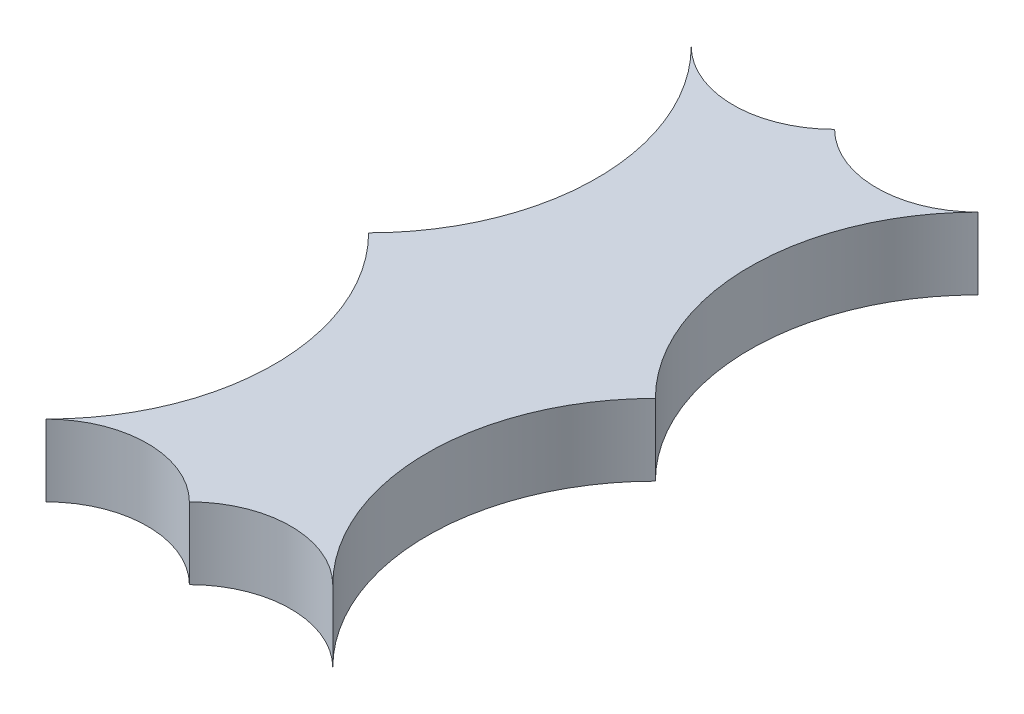
ISO-10303-21;
HEADER;
FILE_DESCRIPTION(('STEP AP214'),'2;1');
FILE_NAME('part.step','',(''),(''),'','','');
FILE_SCHEMA(('AUTOMOTIVE_DESIGN { 1 0 10303 214 1 1 1 1 }'));
ENDSEC;
DATA;
#1=APPLICATION_CONTEXT('core data for automotive mechanical design processes');
#2=APPLICATION_PROTOCOL_DEFINITION('international standard','automotive_design',2000,#1);
#3=PRODUCT_CONTEXT('',#1,'mechanical');
#4=PRODUCT('Part','Part','',(#3));
#5=PRODUCT_RELATED_PRODUCT_CATEGORY('part','',(#4));
#6=PRODUCT_DEFINITION_FORMATION('','',#4);
#7=PRODUCT_DEFINITION_CONTEXT('part definition',#1,'design');
#8=PRODUCT_DEFINITION('design','',#6,#7);
#9=PRODUCT_DEFINITION_SHAPE('','',#8);
#10=(LENGTH_UNIT() NAMED_UNIT(*) SI_UNIT(.MILLI.,.METRE.));
#11=(NAMED_UNIT(*) PLANE_ANGLE_UNIT() SI_UNIT($,.RADIAN.));
#12=(NAMED_UNIT(*) SI_UNIT($,.STERADIAN.) SOLID_ANGLE_UNIT());
#13=UNCERTAINTY_MEASURE_WITH_UNIT(LENGTH_MEASURE(1.E-05),#10,'distance_accuracy_value','');
#14=(GEOMETRIC_REPRESENTATION_CONTEXT(3) GLOBAL_UNCERTAINTY_ASSIGNED_CONTEXT((#13)) GLOBAL_UNIT_ASSIGNED_CONTEXT((#10,
#11,#12)) REPRESENTATION_CONTEXT('',''));
#15=CARTESIAN_POINT('',(0.,0.,0.));
#16=DIRECTION('',(0.,0.,1.));
#17=DIRECTION('',(1.,0.,0.));
#18=AXIS2_PLACEMENT_3D('',#15,#16,#17);
#19=CARTESIAN_POINT('',(33.9500661578985,4.,-49.2380522932094));
#20=DIRECTION('',(0.,-1.,0.));
#21=DIRECTION('',(0.,0.,-1.));
#22=AXIS2_PLACEMENT_3D('',#19,#20,#21);
#23=CYLINDRICAL_SURFACE('',#22,5.65685424949223);
#24=CARTESIAN_POINT('',(33.9500661578985,0.,-49.2380522932094));
#25=DIRECTION('',(0.,-1.,0.));
#26=DIRECTION('',(0.,0.,-1.));
#27=AXIS2_PLACEMENT_3D('',#24,#25,#26);
#28=CIRCLE('',#27,5.65685424949223);
#29=CARTESIAN_POINT('',(37.9500661578985,0.,-45.2380522932096));
#30=VERTEX_POINT('',#29);
#31=CARTESIAN_POINT('',(29.9500661578985,0.,-45.2380522932096));
#32=VERTEX_POINT('',#31);
#33=EDGE_CURVE('E147',#30,#32,#28,.T.);
#34=ORIENTED_EDGE('',*,*,#33,.T.);
#35=DIRECTION('',(0.,-1.,0.));
#36=VECTOR('',#35,1.);
#37=CARTESIAN_POINT('',(29.9500661578985,4.,-45.2380522932096));
#38=LINE('',#37,#36);
#39=CARTESIAN_POINT('',(29.9500661578985,4.,-45.2380522932096));
#40=VERTEX_POINT('',#39);
#41=EDGE_CURVE('E11',#40,#32,#38,.T.);
#42=ORIENTED_EDGE('',*,*,#41,.F.);
#43=CARTESIAN_POINT('',(33.9500661578985,4.,-49.2380522932094));
#44=DIRECTION('',(0.,-1.,0.));
#45=DIRECTION('',(0.,0.,-1.));
#46=AXIS2_PLACEMENT_3D('',#43,#44,#45);
#47=CIRCLE('',#46,5.65685424949223);
#48=CARTESIAN_POINT('',(37.9500661578985,4.,-45.2380522932096));
#49=VERTEX_POINT('',#48);
#50=EDGE_CURVE('E166',#49,#40,#47,.T.);
#51=ORIENTED_EDGE('',*,*,#50,.F.);
#52=DIRECTION('',(0.,-1.,0.));
#53=VECTOR('',#52,1.);
#54=CARTESIAN_POINT('',(37.9500661578985,4.,-45.2380522932096));
#55=LINE('',#54,#53);
#56=EDGE_CURVE('E145',#49,#30,#55,.T.);
#57=ORIENTED_EDGE('',*,*,#56,.T.);
#58=EDGE_LOOP('',(#34,#42,#51,#57));
#59=FACE_BOUND('',#58,.T.);
#60=ADVANCED_FACE('F44',(#59),#23,.F.);
#61=CARTESIAN_POINT('',(25.9500661578985,4.,-49.2380522932094));
#62=DIRECTION('',(0.,-1.,0.));
#63=DIRECTION('',(0.,0.,-1.));
#64=AXIS2_PLACEMENT_3D('',#61,#62,#63);
#65=CYLINDRICAL_SURFACE('',#64,5.65685424949223);
#66=CARTESIAN_POINT('',(25.9500661578985,0.,-49.2380522932094));
#67=DIRECTION('',(0.,-1.,0.));
#68=DIRECTION('',(0.,0.,1.));
#69=AXIS2_PLACEMENT_3D('',#66,#67,#68);
#70=CIRCLE('',#69,5.65685424949223);
#71=CARTESIAN_POINT('',(21.9500661578985,0.,-45.2380522932095));
#72=VERTEX_POINT('',#71);
#73=EDGE_CURVE('E148',#32,#72,#70,.T.);
#74=ORIENTED_EDGE('',*,*,#73,.T.);
#75=DIRECTION('',(0.,-1.,0.));
#76=VECTOR('',#75,1.);
#77=CARTESIAN_POINT('',(21.9500661578985,4.,-45.2380522932095));
#78=LINE('',#77,#76);
#79=CARTESIAN_POINT('',(21.9500661578985,4.,-45.2380522932095));
#80=VERTEX_POINT('',#79);
#81=EDGE_CURVE('E53',#80,#72,#78,.T.);
#82=ORIENTED_EDGE('',*,*,#81,.F.);
#83=CARTESIAN_POINT('',(25.9500661578985,4.,-49.2380522932094));
#84=DIRECTION('',(0.,-1.,0.));
#85=DIRECTION('',(0.,0.,1.));
#86=AXIS2_PLACEMENT_3D('',#83,#84,#85);
#87=CIRCLE('',#86,5.65685424949223);
#88=EDGE_CURVE('E103',#40,#80,#87,.T.);
#89=ORIENTED_EDGE('',*,*,#88,.F.);
#90=ORIENTED_EDGE('',*,*,#41,.T.);
#91=EDGE_LOOP('',(#74,#82,#89,#90));
#92=FACE_BOUND('',#91,.T.);
#93=ADVANCED_FACE('F215',(#92),#65,.F.);
#94=CARTESIAN_POINT('',(12.9500661578984,4.,-36.2380522932096));
#95=DIRECTION('',(0.,-1.,0.));
#96=DIRECTION('',(0.,0.,-1.));
#97=AXIS2_PLACEMENT_3D('',#94,#95,#96);
#98=CYLINDRICAL_SURFACE('',#97,12.7279220613579);
#99=CARTESIAN_POINT('',(12.9500661578984,0.,-36.2380522932096));
#100=DIRECTION('',(0.,-1.,0.));
#101=DIRECTION('',(0.,0.,-1.));
#102=AXIS2_PLACEMENT_3D('',#99,#100,#101);
#103=CIRCLE('',#102,12.7279220613579);
#104=CARTESIAN_POINT('',(21.9500661578984,0.,-27.2380522932096));
#105=VERTEX_POINT('',#104);
#106=EDGE_CURVE('E154',#72,#105,#103,.T.);
#107=ORIENTED_EDGE('',*,*,#106,.T.);
#108=DIRECTION('',(0.,-1.,0.));
#109=VECTOR('',#108,1.);
#110=CARTESIAN_POINT('',(21.9500661578984,4.,-27.2380522932096));
#111=LINE('',#110,#109);
#112=CARTESIAN_POINT('',(21.9500661578984,4.,-27.2380522932096));
#113=VERTEX_POINT('',#112);
#114=EDGE_CURVE('E177',#113,#105,#111,.T.);
#115=ORIENTED_EDGE('',*,*,#114,.F.);
#116=CARTESIAN_POINT('',(12.9500661578984,4.,-36.2380522932096));
#117=DIRECTION('',(0.,-1.,0.));
#118=DIRECTION('',(0.,0.,-1.));
#119=AXIS2_PLACEMENT_3D('',#116,#117,#118);
#120=CIRCLE('',#119,12.7279220613579);
#121=EDGE_CURVE('E188',#80,#113,#120,.T.);
#122=ORIENTED_EDGE('',*,*,#121,.F.);
#123=ORIENTED_EDGE('',*,*,#81,.T.);
#124=EDGE_LOOP('',(#107,#115,#122,#123));
#125=FACE_BOUND('',#124,.T.);
#126=ADVANCED_FACE('F190',(#125),#98,.F.);
#127=CARTESIAN_POINT('',(12.9500661579,4.,-18.2380522932049));
#128=DIRECTION('',(0.,-1.,0.));
#129=DIRECTION('',(0.,0.,-1.));
#130=AXIS2_PLACEMENT_3D('',#127,#128,#129);
#131=CYLINDRICAL_SURFACE('',#130,12.7279220613601);
#132=CARTESIAN_POINT('',(12.9500661579,0.,-18.2380522932049));
#133=DIRECTION('',(0.,-1.,0.));
#134=DIRECTION('',(0.,0.,1.));
#135=AXIS2_PLACEMENT_3D('',#132,#133,#134);
#136=CIRCLE('',#135,12.7279220613601);
#137=CARTESIAN_POINT('',(21.9500661579016,0.,-9.23805229320335));
#138=VERTEX_POINT('',#137);
#139=EDGE_CURVE('E157',#105,#138,#136,.T.);
#140=ORIENTED_EDGE('',*,*,#139,.T.);
#141=DIRECTION('',(0.,-1.,0.));
#142=VECTOR('',#141,1.);
#143=CARTESIAN_POINT('',(21.9500661579016,4.,-9.23805229320335));
#144=LINE('',#143,#142);
#145=CARTESIAN_POINT('',(21.9500661579016,4.,-9.23805229320335));
#146=VERTEX_POINT('',#145);
#147=EDGE_CURVE('E172',#146,#138,#144,.T.);
#148=ORIENTED_EDGE('',*,*,#147,.F.);
#149=CARTESIAN_POINT('',(12.9500661579,4.,-18.2380522932049));
#150=DIRECTION('',(0.,-1.,0.));
#151=DIRECTION('',(0.,0.,1.));
#152=AXIS2_PLACEMENT_3D('',#149,#150,#151);
#153=CIRCLE('',#152,12.7279220613601);
#154=EDGE_CURVE('E205',#113,#146,#153,.T.);
#155=ORIENTED_EDGE('',*,*,#154,.F.);
#156=ORIENTED_EDGE('',*,*,#114,.T.);
#157=EDGE_LOOP('',(#140,#148,#155,#156));
#158=FACE_BOUND('',#157,.T.);
#159=ADVANCED_FACE('F197',(#158),#131,.F.);
#160=CARTESIAN_POINT('',(25.9500661579016,4.,-5.23805229320356));
#161=DIRECTION('',(0.,-1.,0.));
#162=DIRECTION('',(0.,0.,-1.));
#163=AXIS2_PLACEMENT_3D('',#160,#161,#162);
#164=CYLINDRICAL_SURFACE('',#163,5.65685424949223);
#165=CARTESIAN_POINT('',(25.9500661579016,0.,-5.23805229320356));
#166=DIRECTION('',(0.,-1.,0.));
#167=DIRECTION('',(0.,0.,-1.));
#168=AXIS2_PLACEMENT_3D('',#165,#166,#167);
#169=CIRCLE('',#168,5.65685424949223);
#170=CARTESIAN_POINT('',(29.9500661579016,0.,-9.23805229320335));
#171=VERTEX_POINT('',#170);
#172=EDGE_CURVE('E159',#138,#171,#169,.T.);
#173=ORIENTED_EDGE('',*,*,#172,.T.);
#174=DIRECTION('',(0.,-1.,0.));
#175=VECTOR('',#174,1.);
#176=CARTESIAN_POINT('',(29.9500661579016,4.,-9.23805229320335));
#177=LINE('',#176,#175);
#178=CARTESIAN_POINT('',(29.9500661579016,4.,-9.23805229320335));
#179=VERTEX_POINT('',#178);
#180=EDGE_CURVE('E134',#179,#171,#177,.T.);
#181=ORIENTED_EDGE('',*,*,#180,.F.);
#182=CARTESIAN_POINT('',(25.9500661579016,4.,-5.23805229320356));
#183=DIRECTION('',(0.,-1.,0.));
#184=DIRECTION('',(0.,0.,-1.));
#185=AXIS2_PLACEMENT_3D('',#182,#183,#184);
#186=CIRCLE('',#185,5.65685424949223);
#187=EDGE_CURVE('E125',#146,#179,#186,.T.);
#188=ORIENTED_EDGE('',*,*,#187,.F.);
#189=ORIENTED_EDGE('',*,*,#147,.T.);
#190=EDGE_LOOP('',(#173,#181,#188,#189));
#191=FACE_BOUND('',#190,.T.);
#192=ADVANCED_FACE('F200',(#191),#164,.F.);
#193=CARTESIAN_POINT('',(33.9500661579016,4.,-5.23805229320356));
#194=DIRECTION('',(0.,-1.,0.));
#195=DIRECTION('',(0.,0.,-1.));
#196=AXIS2_PLACEMENT_3D('',#193,#194,#195);
#197=CYLINDRICAL_SURFACE('',#196,5.65685424949223);
#198=CARTESIAN_POINT('',(33.9500661579016,0.,-5.23805229320356));
#199=DIRECTION('',(0.,-1.,0.));
#200=DIRECTION('',(0.,0.,1.));
#201=AXIS2_PLACEMENT_3D('',#198,#199,#200);
#202=CIRCLE('',#201,5.65685424949223);
#203=CARTESIAN_POINT('',(37.9500661579016,0.,-9.23805229320335));
#204=VERTEX_POINT('',#203);
#205=EDGE_CURVE('E133',#171,#204,#202,.T.);
#206=ORIENTED_EDGE('',*,*,#205,.T.);
#207=DIRECTION('',(0.,-1.,0.));
#208=VECTOR('',#207,1.);
#209=CARTESIAN_POINT('',(37.9500661579016,4.,-9.23805229320335));
#210=LINE('',#209,#208);
#211=CARTESIAN_POINT('',(37.9500661579016,4.,-9.23805229320335));
#212=VERTEX_POINT('',#211);
#213=EDGE_CURVE('E127',#212,#204,#210,.T.);
#214=ORIENTED_EDGE('',*,*,#213,.F.);
#215=CARTESIAN_POINT('',(33.9500661579016,4.,-5.23805229320356));
#216=DIRECTION('',(0.,-1.,0.));
#217=DIRECTION('',(0.,0.,1.));
#218=AXIS2_PLACEMENT_3D('',#215,#216,#217);
#219=CIRCLE('',#218,5.65685424949223);
#220=EDGE_CURVE('E119',#179,#212,#219,.T.);
#221=ORIENTED_EDGE('',*,*,#220,.F.);
#222=ORIENTED_EDGE('',*,*,#180,.T.);
#223=EDGE_LOOP('',(#206,#214,#221,#222));
#224=FACE_BOUND('',#223,.T.);
#225=ADVANCED_FACE('F131',(#224),#197,.F.);
#226=CARTESIAN_POINT('',(46.9500661579032,4.,-18.2380522932049));
#227=DIRECTION('',(0.,-1.,0.));
#228=DIRECTION('',(0.,0.,-1.));
#229=AXIS2_PLACEMENT_3D('',#226,#227,#228);
#230=CYLINDRICAL_SURFACE('',#229,12.7279220613601);
#231=CARTESIAN_POINT('',(46.9500661579032,0.,-18.2380522932049));
#232=DIRECTION('',(0.,-1.,0.));
#233=DIRECTION('',(0.,0.,-1.));
#234=AXIS2_PLACEMENT_3D('',#231,#232,#233);
#235=CIRCLE('',#234,12.7279220613601);
#236=CARTESIAN_POINT('',(37.9500661579017,0.,-27.2380522932065));
#237=VERTEX_POINT('',#236);
#238=EDGE_CURVE('E91',#204,#237,#235,.T.);
#239=ORIENTED_EDGE('',*,*,#238,.T.);
#240=DIRECTION('',(0.,-1.,0.));
#241=VECTOR('',#240,1.);
#242=CARTESIAN_POINT('',(37.9500661579017,4.,-27.2380522932065));
#243=LINE('',#242,#241);
#244=CARTESIAN_POINT('',(37.9500661579017,4.,-27.2380522932065));
#245=VERTEX_POINT('',#244);
#246=EDGE_CURVE('E136',#245,#237,#243,.T.);
#247=ORIENTED_EDGE('',*,*,#246,.F.);
#248=CARTESIAN_POINT('',(46.9500661579032,4.,-18.2380522932049));
#249=DIRECTION('',(0.,-1.,0.));
#250=DIRECTION('',(0.,0.,-1.));
#251=AXIS2_PLACEMENT_3D('',#248,#249,#250);
#252=CIRCLE('',#251,12.7279220613601);
#253=EDGE_CURVE('E122',#212,#245,#252,.T.);
#254=ORIENTED_EDGE('',*,*,#253,.F.);
#255=ORIENTED_EDGE('',*,*,#213,.T.);
#256=EDGE_LOOP('',(#239,#247,#254,#255));
#257=FACE_BOUND('',#256,.T.);
#258=ADVANCED_FACE('F138',(#257),#230,.F.);
#259=CARTESIAN_POINT('',(46.9500661578985,4.,-36.2380522932096));
#260=DIRECTION('',(0.,-1.,0.));
#261=DIRECTION('',(0.,0.,-1.));
#262=AXIS2_PLACEMENT_3D('',#259,#260,#261);
#263=CYLINDRICAL_SURFACE('',#262,12.7279220613579);
#264=CARTESIAN_POINT('',(46.9500661578985,0.,-36.2380522932096));
#265=DIRECTION('',(0.,-1.,0.));
#266=DIRECTION('',(0.,0.,1.));
#267=AXIS2_PLACEMENT_3D('',#264,#265,#266);
#268=CIRCLE('',#267,12.7279220613579);
#269=EDGE_CURVE('E100',#237,#30,#268,.T.);
#270=ORIENTED_EDGE('',*,*,#269,.T.);
#271=ORIENTED_EDGE('',*,*,#56,.F.);
#272=CARTESIAN_POINT('',(46.9500661578985,4.,-36.2380522932096));
#273=DIRECTION('',(0.,-1.,0.));
#274=DIRECTION('',(0.,0.,1.));
#275=AXIS2_PLACEMENT_3D('',#272,#273,#274);
#276=CIRCLE('',#275,12.7279220613579);
#277=EDGE_CURVE('E62',#245,#49,#276,.T.);
#278=ORIENTED_EDGE('',*,*,#277,.F.);
#279=ORIENTED_EDGE('',*,*,#246,.T.);
#280=EDGE_LOOP('',(#270,#271,#278,#279));
#281=FACE_BOUND('',#280,.T.);
#282=ADVANCED_FACE('F229',(#281),#263,.F.);
#283=CARTESIAN_POINT('',(29.9500661578985,4.,-49.2380522932094));
#284=DIRECTION('',(0.,-1.,0.));
#285=DIRECTION('',(0.,0.,-1.));
#286=AXIS2_PLACEMENT_3D('',#283,#284,#285);
#287=PLANE('',#286);
#288=ORIENTED_EDGE('',*,*,#50,.T.);
#289=ORIENTED_EDGE('',*,*,#88,.T.);
#290=ORIENTED_EDGE('',*,*,#121,.T.);
#291=ORIENTED_EDGE('',*,*,#154,.T.);
#292=ORIENTED_EDGE('',*,*,#187,.T.);
#293=ORIENTED_EDGE('',*,*,#220,.T.);
#294=ORIENTED_EDGE('',*,*,#253,.T.);
#295=ORIENTED_EDGE('',*,*,#277,.T.);
#296=EDGE_LOOP('',(#288,#289,#290,#291,#292,#293,#294,#295));
#297=FACE_BOUND('',#296,.T.);
#298=ADVANCED_FACE('F120',(#297),#287,.F.);
#299=CARTESIAN_POINT('',(29.9500661578985,0.,-49.2380522932094));
#300=DIRECTION('',(0.,-1.,0.));
#301=DIRECTION('',(0.,0.,-1.));
#302=AXIS2_PLACEMENT_3D('',#299,#300,#301);
#303=PLANE('',#302);
#304=ORIENTED_EDGE('',*,*,#33,.F.);
#305=ORIENTED_EDGE('',*,*,#269,.F.);
#306=ORIENTED_EDGE('',*,*,#238,.F.);
#307=ORIENTED_EDGE('',*,*,#205,.F.);
#308=ORIENTED_EDGE('',*,*,#172,.F.);
#309=ORIENTED_EDGE('',*,*,#139,.F.);
#310=ORIENTED_EDGE('',*,*,#106,.F.);
#311=ORIENTED_EDGE('',*,*,#73,.F.);
#312=EDGE_LOOP('',(#304,#305,#306,#307,#308,#309,#310,#311));
#313=FACE_BOUND('',#312,.T.);
#314=ADVANCED_FACE('F194',(#313),#303,.T.);
#315=CLOSED_SHELL('',(#60,#93,#126,#159,#192,#225,#258,#282,#298,#314));
#316=MANIFOLD_SOLID_BREP('B2',#315);
#317=ADVANCED_BREP_SHAPE_REPRESENTATION('',(#18,#316),#14);
#318=SHAPE_DEFINITION_REPRESENTATION(#9,#317);
ENDSEC;
END-ISO-10303-21;
